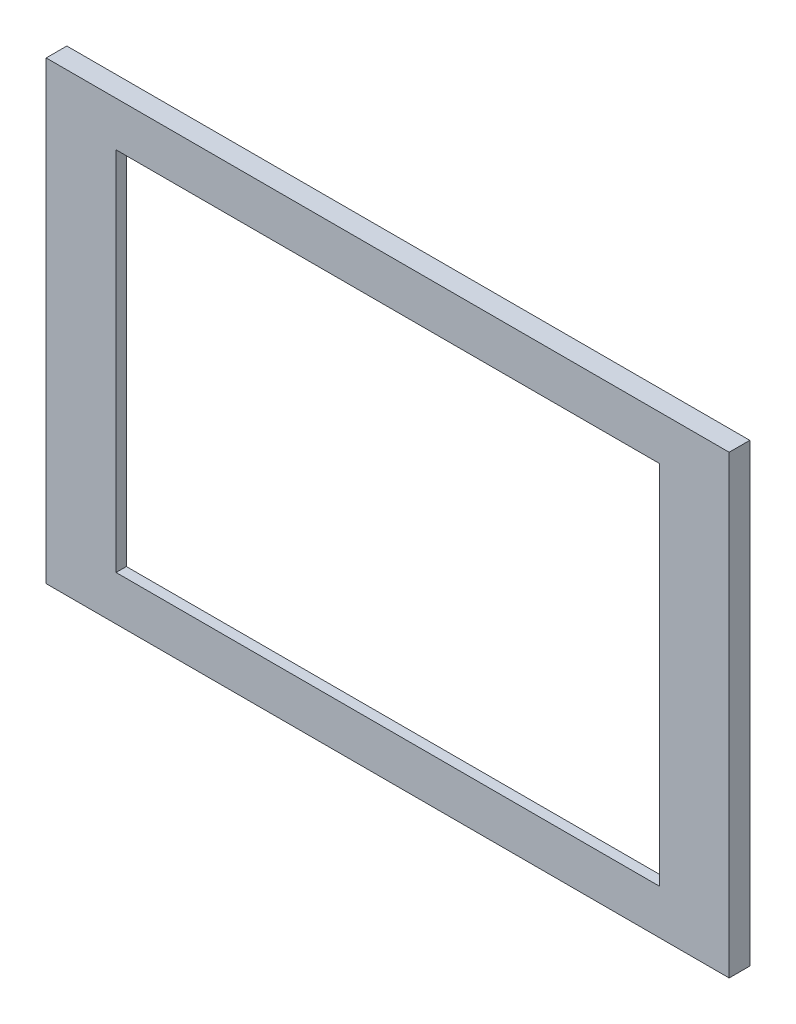
ISO-10303-21;
HEADER;
FILE_DESCRIPTION(('STEP AP214'),'2;1');
FILE_NAME('part.step','',(''),(''),'','','');
FILE_SCHEMA(('AUTOMOTIVE_DESIGN { 1 0 10303 214 1 1 1 1 }'));
ENDSEC;
DATA;
#1=APPLICATION_CONTEXT('core data for automotive mechanical design processes');
#2=APPLICATION_PROTOCOL_DEFINITION('international standard','automotive_design',2000,#1);
#3=PRODUCT_CONTEXT('',#1,'mechanical');
#4=PRODUCT('Part','Part','',(#3));
#5=PRODUCT_RELATED_PRODUCT_CATEGORY('part','',(#4));
#6=PRODUCT_DEFINITION_FORMATION('','',#4);
#7=PRODUCT_DEFINITION_CONTEXT('part definition',#1,'design');
#8=PRODUCT_DEFINITION('design','',#6,#7);
#9=PRODUCT_DEFINITION_SHAPE('','',#8);
#10=(LENGTH_UNIT() NAMED_UNIT(*) SI_UNIT(.MILLI.,.METRE.));
#11=(NAMED_UNIT(*) PLANE_ANGLE_UNIT() SI_UNIT($,.RADIAN.));
#12=(NAMED_UNIT(*) SI_UNIT($,.STERADIAN.) SOLID_ANGLE_UNIT());
#13=UNCERTAINTY_MEASURE_WITH_UNIT(LENGTH_MEASURE(1.E-05),#10,'distance_accuracy_value','');
#14=(GEOMETRIC_REPRESENTATION_CONTEXT(3) GLOBAL_UNCERTAINTY_ASSIGNED_CONTEXT((#13)) GLOBAL_UNIT_ASSIGNED_CONTEXT((#10,
#11,#12)) REPRESENTATION_CONTEXT('',''));
#15=CARTESIAN_POINT('',(0.,0.,0.));
#16=DIRECTION('',(0.,0.,1.));
#17=DIRECTION('',(1.,0.,0.));
#18=AXIS2_PLACEMENT_3D('',#15,#16,#17);
#19=CARTESIAN_POINT('',(0.,0.,3.175));
#20=DIRECTION('',(0.,0.,1.));
#21=DIRECTION('',(1.,0.,0.));
#22=AXIS2_PLACEMENT_3D('',#19,#20,#21);
#23=PLANE('',#22);
#24=DIRECTION('',(-1.,0.,0.));
#25=VECTOR('',#24,1.);
#26=CARTESIAN_POINT('',(-41.76,28.14,3.175));
#27=LINE('',#26,#25);
#28=CARTESIAN_POINT('',(41.76,28.14,3.175));
#29=VERTEX_POINT('',#28);
#30=CARTESIAN_POINT('',(-41.76,28.14,3.175));
#31=VERTEX_POINT('',#30);
#32=EDGE_CURVE('E231',#29,#31,#27,.T.);
#33=ORIENTED_EDGE('',*,*,#32,.F.);
#34=DIRECTION('',(0.,1.,0.));
#35=VECTOR('',#34,1.);
#36=CARTESIAN_POINT('',(41.76,-28.14,3.175));
#37=LINE('',#36,#35);
#38=CARTESIAN_POINT('',(41.76,-28.14,3.175));
#39=VERTEX_POINT('',#38);
#40=EDGE_CURVE('E219',#39,#29,#37,.T.);
#41=ORIENTED_EDGE('',*,*,#40,.F.);
#42=DIRECTION('',(1.,0.,0.));
#43=VECTOR('',#42,1.);
#44=CARTESIAN_POINT('',(-41.76,-28.14,3.175));
#45=LINE('',#44,#43);
#46=CARTESIAN_POINT('',(-41.76,-28.14,3.175));
#47=VERTEX_POINT('',#46);
#48=EDGE_CURVE('E238',#47,#39,#45,.T.);
#49=ORIENTED_EDGE('',*,*,#48,.F.);
#50=DIRECTION('',(0.,-1.,0.));
#51=VECTOR('',#50,1.);
#52=CARTESIAN_POINT('',(-41.76,-28.14,3.175));
#53=LINE('',#52,#51);
#54=EDGE_CURVE('E234',#31,#47,#53,.T.);
#55=ORIENTED_EDGE('',*,*,#54,.F.);
#56=EDGE_LOOP('',(#33,#41,#49,#55));
#57=FACE_BOUND('',#56,.T.);
#58=DIRECTION('',(1.,0.,0.));
#59=VECTOR('',#58,1.);
#60=CARTESIAN_POINT('',(-52.5,-35.,3.175));
#61=LINE('',#60,#59);
#62=CARTESIAN_POINT('',(-52.5,-35.,3.175));
#63=VERTEX_POINT('',#62);
#64=CARTESIAN_POINT('',(52.5,-35.,3.175));
#65=VERTEX_POINT('',#64);
#66=EDGE_CURVE('E145',#63,#65,#61,.T.);
#67=ORIENTED_EDGE('',*,*,#66,.T.);
#68=DIRECTION('',(0.,1.,0.));
#69=VECTOR('',#68,1.);
#70=CARTESIAN_POINT('',(52.5,35.,3.175));
#71=LINE('',#70,#69);
#72=CARTESIAN_POINT('',(52.5,35.,3.175));
#73=VERTEX_POINT('',#72);
#74=EDGE_CURVE('E158',#65,#73,#71,.T.);
#75=ORIENTED_EDGE('',*,*,#74,.T.);
#76=DIRECTION('',(-1.,0.,0.));
#77=VECTOR('',#76,1.);
#78=CARTESIAN_POINT('',(-52.5,35.,3.175));
#79=LINE('',#78,#77);
#80=CARTESIAN_POINT('',(-52.5,35.,3.175));
#81=VERTEX_POINT('',#80);
#82=EDGE_CURVE('E154',#73,#81,#79,.T.);
#83=ORIENTED_EDGE('',*,*,#82,.T.);
#84=DIRECTION('',(0.,-1.,0.));
#85=VECTOR('',#84,1.);
#86=CARTESIAN_POINT('',(-52.5,35.,3.175));
#87=LINE('',#86,#85);
#88=EDGE_CURVE('E61',#81,#63,#87,.T.);
#89=ORIENTED_EDGE('',*,*,#88,.T.);
#90=EDGE_LOOP('',(#67,#75,#83,#89));
#91=FACE_BOUND('',#90,.T.);
#92=ADVANCED_FACE('F45',(#57,#91),#23,.T.);
#93=CARTESIAN_POINT('',(0.,0.,0.));
#94=DIRECTION('',(0.,0.,1.));
#95=DIRECTION('',(1.,0.,0.));
#96=AXIS2_PLACEMENT_3D('',#93,#94,#95);
#97=PLANE('',#96);
#98=DIRECTION('',(1.,0.,0.));
#99=VECTOR('',#98,1.);
#100=CARTESIAN_POINT('',(47.385,30.54,0.));
#101=LINE('',#100,#99);
#102=CARTESIAN_POINT('',(-48.76,30.54,0.));
#103=VERTEX_POINT('',#102);
#104=CARTESIAN_POINT('',(47.385,30.54,0.));
#105=VERTEX_POINT('',#104);
#106=EDGE_CURVE('E205',#103,#105,#101,.T.);
#107=ORIENTED_EDGE('',*,*,#106,.F.);
#108=DIRECTION('',(0.,1.,0.));
#109=VECTOR('',#108,1.);
#110=CARTESIAN_POINT('',(-48.76,30.54,0.));
#111=LINE('',#110,#109);
#112=CARTESIAN_POINT('',(-48.76,-30.54,0.));
#113=VERTEX_POINT('',#112);
#114=EDGE_CURVE('E184',#113,#103,#111,.T.);
#115=ORIENTED_EDGE('',*,*,#114,.F.);
#116=DIRECTION('',(-1.,0.,0.));
#117=VECTOR('',#116,1.);
#118=CARTESIAN_POINT('',(47.385,-30.54,0.));
#119=LINE('',#118,#117);
#120=CARTESIAN_POINT('',(47.385,-30.54,0.));
#121=VERTEX_POINT('',#120);
#122=EDGE_CURVE('E190',#121,#113,#119,.T.);
#123=ORIENTED_EDGE('',*,*,#122,.F.);
#124=DIRECTION('',(0.,-1.,0.));
#125=VECTOR('',#124,1.);
#126=CARTESIAN_POINT('',(47.385,30.54,0.));
#127=LINE('',#126,#125);
#128=EDGE_CURVE('E209',#105,#121,#127,.T.);
#129=ORIENTED_EDGE('',*,*,#128,.F.);
#130=EDGE_LOOP('',(#107,#115,#123,#129));
#131=FACE_BOUND('',#130,.T.);
#132=DIRECTION('',(0.,1.,0.));
#133=VECTOR('',#132,1.);
#134=CARTESIAN_POINT('',(52.5,0.,0.));
#135=LINE('',#134,#133);
#136=CARTESIAN_POINT('',(52.5,-35.,0.));
#137=VERTEX_POINT('',#136);
#138=CARTESIAN_POINT('',(52.5,35.,0.));
#139=VERTEX_POINT('',#138);
#140=EDGE_CURVE('E11',#137,#139,#135,.T.);
#141=ORIENTED_EDGE('',*,*,#140,.F.);
#142=DIRECTION('',(1.,0.,0.));
#143=VECTOR('',#142,1.);
#144=CARTESIAN_POINT('',(0.,-35.,0.));
#145=LINE('',#144,#143);
#146=CARTESIAN_POINT('',(-52.5,-35.,0.));
#147=VERTEX_POINT('',#146);
#148=EDGE_CURVE('E54',#147,#137,#145,.T.);
#149=ORIENTED_EDGE('',*,*,#148,.F.);
#150=DIRECTION('',(0.,-1.,0.));
#151=VECTOR('',#150,1.);
#152=CARTESIAN_POINT('',(-52.5,0.,0.));
#153=LINE('',#152,#151);
#154=CARTESIAN_POINT('',(-52.5,35.,0.));
#155=VERTEX_POINT('',#154);
#156=EDGE_CURVE('E137',#155,#147,#153,.T.);
#157=ORIENTED_EDGE('',*,*,#156,.F.);
#158=DIRECTION('',(-1.,0.,0.));
#159=VECTOR('',#158,1.);
#160=CARTESIAN_POINT('',(0.,35.,0.));
#161=LINE('',#160,#159);
#162=EDGE_CURVE('E257',#139,#155,#161,.T.);
#163=ORIENTED_EDGE('',*,*,#162,.F.);
#164=EDGE_LOOP('',(#141,#149,#157,#163));
#165=FACE_BOUND('',#164,.T.);
#166=ADVANCED_FACE('F47',(#131,#165),#97,.F.);
#167=CARTESIAN_POINT('',(41.76,-28.14,3.175));
#168=DIRECTION('',(-1.,0.,0.));
#169=DIRECTION('',(0.,0.,1.));
#170=AXIS2_PLACEMENT_3D('',#167,#168,#169);
#171=PLANE('',#170);
#172=DIRECTION('',(0.,0.,-1.));
#173=VECTOR('',#172,1.);
#174=CARTESIAN_POINT('',(41.76,28.14,3.175));
#175=LINE('',#174,#173);
#176=CARTESIAN_POINT('',(41.76,28.14,1.5875));
#177=VERTEX_POINT('',#176);
#178=EDGE_CURVE('E253',#29,#177,#175,.T.);
#179=ORIENTED_EDGE('',*,*,#178,.T.);
#180=DIRECTION('',(0.,-1.,0.));
#181=VECTOR('',#180,1.);
#182=CARTESIAN_POINT('',(41.76,-28.14,1.5875));
#183=LINE('',#182,#181);
#184=CARTESIAN_POINT('',(41.76,-28.14,1.5875));
#185=VERTEX_POINT('',#184);
#186=EDGE_CURVE('E172',#177,#185,#183,.T.);
#187=ORIENTED_EDGE('',*,*,#186,.T.);
#188=DIRECTION('',(0.,0.,-1.));
#189=VECTOR('',#188,1.);
#190=CARTESIAN_POINT('',(41.76,-28.14,3.175));
#191=LINE('',#190,#189);
#192=EDGE_CURVE('E241',#39,#185,#191,.T.);
#193=ORIENTED_EDGE('',*,*,#192,.F.);
#194=ORIENTED_EDGE('',*,*,#40,.T.);
#195=EDGE_LOOP('',(#179,#187,#193,#194));
#196=FACE_BOUND('',#195,.T.);
#197=ADVANCED_FACE('F282',(#196),#171,.T.);
#198=CARTESIAN_POINT('',(-41.76,28.14,3.175));
#199=DIRECTION('',(0.,-1.,0.));
#200=DIRECTION('',(0.,0.,-1.));
#201=AXIS2_PLACEMENT_3D('',#198,#199,#200);
#202=PLANE('',#201);
#203=DIRECTION('',(0.,0.,-1.));
#204=VECTOR('',#203,1.);
#205=CARTESIAN_POINT('',(-41.76,28.14,3.175));
#206=LINE('',#205,#204);
#207=CARTESIAN_POINT('',(-41.76,28.14,1.5875));
#208=VERTEX_POINT('',#207);
#209=EDGE_CURVE('E249',#31,#208,#206,.T.);
#210=ORIENTED_EDGE('',*,*,#209,.T.);
#211=DIRECTION('',(1.,0.,0.));
#212=VECTOR('',#211,1.);
#213=CARTESIAN_POINT('',(41.76,28.14,1.5875));
#214=LINE('',#213,#212);
#215=EDGE_CURVE('E163',#208,#177,#214,.T.);
#216=ORIENTED_EDGE('',*,*,#215,.T.);
#217=ORIENTED_EDGE('',*,*,#178,.F.);
#218=ORIENTED_EDGE('',*,*,#32,.T.);
#219=EDGE_LOOP('',(#210,#216,#217,#218));
#220=FACE_BOUND('',#219,.T.);
#221=ADVANCED_FACE('F288',(#220),#202,.T.);
#222=CARTESIAN_POINT('',(-41.76,-28.14,3.175));
#223=DIRECTION('',(1.,0.,0.));
#224=DIRECTION('',(0.,0.,-1.));
#225=AXIS2_PLACEMENT_3D('',#222,#223,#224);
#226=PLANE('',#225);
#227=DIRECTION('',(0.,0.,-1.));
#228=VECTOR('',#227,1.);
#229=CARTESIAN_POINT('',(-41.76,-28.14,3.175));
#230=LINE('',#229,#228);
#231=CARTESIAN_POINT('',(-41.76,-28.14,1.5875));
#232=VERTEX_POINT('',#231);
#233=EDGE_CURVE('E245',#47,#232,#230,.T.);
#234=ORIENTED_EDGE('',*,*,#233,.T.);
#235=DIRECTION('',(0.,1.,0.));
#236=VECTOR('',#235,1.);
#237=CARTESIAN_POINT('',(-41.76,28.14,1.5875));
#238=LINE('',#237,#236);
#239=EDGE_CURVE('E180',#232,#208,#238,.T.);
#240=ORIENTED_EDGE('',*,*,#239,.T.);
#241=ORIENTED_EDGE('',*,*,#209,.F.);
#242=ORIENTED_EDGE('',*,*,#54,.T.);
#243=EDGE_LOOP('',(#234,#240,#241,#242));
#244=FACE_BOUND('',#243,.T.);
#245=ADVANCED_FACE('F292',(#244),#226,.T.);
#246=CARTESIAN_POINT('',(-41.76,-28.14,3.175));
#247=DIRECTION('',(0.,1.,0.));
#248=DIRECTION('',(0.,0.,1.));
#249=AXIS2_PLACEMENT_3D('',#246,#247,#248);
#250=PLANE('',#249);
#251=ORIENTED_EDGE('',*,*,#192,.T.);
#252=DIRECTION('',(-1.,0.,0.));
#253=VECTOR('',#252,1.);
#254=CARTESIAN_POINT('',(-41.76,-28.14,1.5875));
#255=LINE('',#254,#253);
#256=EDGE_CURVE('E176',#185,#232,#255,.T.);
#257=ORIENTED_EDGE('',*,*,#256,.T.);
#258=ORIENTED_EDGE('',*,*,#233,.F.);
#259=ORIENTED_EDGE('',*,*,#48,.T.);
#260=EDGE_LOOP('',(#251,#257,#258,#259));
#261=FACE_BOUND('',#260,.T.);
#262=ADVANCED_FACE('F296',(#261),#250,.T.);
#263=CARTESIAN_POINT('',(-48.76,30.54,1.5875));
#264=DIRECTION('',(-1.,0.,0.));
#265=DIRECTION('',(0.,-1.,0.));
#266=AXIS2_PLACEMENT_3D('',#263,#264,#265);
#267=PLANE('',#266);
#268=ORIENTED_EDGE('',*,*,#114,.T.);
#269=DIRECTION('',(0.,0.,-1.));
#270=VECTOR('',#269,1.);
#271=CARTESIAN_POINT('',(-48.76,30.54,1.5875));
#272=LINE('',#271,#270);
#273=CARTESIAN_POINT('',(-48.76,30.54,1.5875));
#274=VERTEX_POINT('',#273);
#275=EDGE_CURVE('E202',#274,#103,#272,.T.);
#276=ORIENTED_EDGE('',*,*,#275,.F.);
#277=DIRECTION('',(0.,1.,0.));
#278=VECTOR('',#277,1.);
#279=CARTESIAN_POINT('',(-48.76,30.54,1.5875));
#280=LINE('',#279,#278);
#281=CARTESIAN_POINT('',(-48.76,-30.54,1.5875));
#282=VERTEX_POINT('',#281);
#283=EDGE_CURVE('E185',#282,#274,#280,.T.);
#284=ORIENTED_EDGE('',*,*,#283,.F.);
#285=DIRECTION('',(0.,0.,-1.));
#286=VECTOR('',#285,1.);
#287=CARTESIAN_POINT('',(-48.76,-30.54,1.5875));
#288=LINE('',#287,#286);
#289=EDGE_CURVE('E216',#282,#113,#288,.T.);
#290=ORIENTED_EDGE('',*,*,#289,.T.);
#291=EDGE_LOOP('',(#268,#276,#284,#290));
#292=FACE_BOUND('',#291,.T.);
#293=ADVANCED_FACE('F300',(#292),#267,.F.);
#294=CARTESIAN_POINT('',(47.385,-30.54,1.5875));
#295=DIRECTION('',(0.,-1.,0.));
#296=DIRECTION('',(1.,0.,0.));
#297=AXIS2_PLACEMENT_3D('',#294,#295,#296);
#298=PLANE('',#297);
#299=ORIENTED_EDGE('',*,*,#122,.T.);
#300=ORIENTED_EDGE('',*,*,#289,.F.);
#301=DIRECTION('',(-1.,0.,0.));
#302=VECTOR('',#301,1.);
#303=CARTESIAN_POINT('',(47.385,-30.54,1.5875));
#304=LINE('',#303,#302);
#305=CARTESIAN_POINT('',(47.385,-30.54,1.5875));
#306=VERTEX_POINT('',#305);
#307=EDGE_CURVE('E198',#306,#282,#304,.T.);
#308=ORIENTED_EDGE('',*,*,#307,.F.);
#309=DIRECTION('',(0.,0.,-1.));
#310=VECTOR('',#309,1.);
#311=CARTESIAN_POINT('',(47.385,-30.54,1.5875));
#312=LINE('',#311,#310);
#313=EDGE_CURVE('E220',#306,#121,#312,.T.);
#314=ORIENTED_EDGE('',*,*,#313,.T.);
#315=EDGE_LOOP('',(#299,#300,#308,#314));
#316=FACE_BOUND('',#315,.T.);
#317=ADVANCED_FACE('F304',(#316),#298,.F.);
#318=CARTESIAN_POINT('',(47.385,30.54,1.5875));
#319=DIRECTION('',(1.,0.,0.));
#320=DIRECTION('',(0.,1.,0.));
#321=AXIS2_PLACEMENT_3D('',#318,#319,#320);
#322=PLANE('',#321);
#323=ORIENTED_EDGE('',*,*,#128,.T.);
#324=ORIENTED_EDGE('',*,*,#313,.F.);
#325=DIRECTION('',(0.,-1.,0.));
#326=VECTOR('',#325,1.);
#327=CARTESIAN_POINT('',(47.385,30.54,1.5875));
#328=LINE('',#327,#326);
#329=CARTESIAN_POINT('',(47.385,30.54,1.5875));
#330=VERTEX_POINT('',#329);
#331=EDGE_CURVE('E194',#330,#306,#328,.T.);
#332=ORIENTED_EDGE('',*,*,#331,.F.);
#333=DIRECTION('',(0.,0.,-1.));
#334=VECTOR('',#333,1.);
#335=CARTESIAN_POINT('',(47.385,30.54,1.5875));
#336=LINE('',#335,#334);
#337=EDGE_CURVE('E223',#330,#105,#336,.T.);
#338=ORIENTED_EDGE('',*,*,#337,.T.);
#339=EDGE_LOOP('',(#323,#324,#332,#338));
#340=FACE_BOUND('',#339,.T.);
#341=ADVANCED_FACE('F310',(#340),#322,.F.);
#342=CARTESIAN_POINT('',(47.385,30.54,1.5875));
#343=DIRECTION('',(0.,1.,0.));
#344=DIRECTION('',(-1.,0.,0.));
#345=AXIS2_PLACEMENT_3D('',#342,#343,#344);
#346=PLANE('',#345);
#347=ORIENTED_EDGE('',*,*,#106,.T.);
#348=ORIENTED_EDGE('',*,*,#337,.F.);
#349=DIRECTION('',(1.,0.,0.));
#350=VECTOR('',#349,1.);
#351=CARTESIAN_POINT('',(47.385,30.54,1.5875));
#352=LINE('',#351,#350);
#353=EDGE_CURVE('E189',#274,#330,#352,.T.);
#354=ORIENTED_EDGE('',*,*,#353,.F.);
#355=ORIENTED_EDGE('',*,*,#275,.T.);
#356=EDGE_LOOP('',(#347,#348,#354,#355));
#357=FACE_BOUND('',#356,.T.);
#358=ADVANCED_FACE('F306',(#357),#346,.F.);
#359=CARTESIAN_POINT('',(0.,0.,1.5875));
#360=DIRECTION('',(0.,0.,-1.));
#361=DIRECTION('',(-1.,0.,0.));
#362=AXIS2_PLACEMENT_3D('',#359,#360,#361);
#363=PLANE('',#362);
#364=ORIENTED_EDGE('',*,*,#239,.F.);
#365=ORIENTED_EDGE('',*,*,#256,.F.);
#366=ORIENTED_EDGE('',*,*,#186,.F.);
#367=ORIENTED_EDGE('',*,*,#215,.F.);
#368=EDGE_LOOP('',(#364,#365,#366,#367));
#369=FACE_BOUND('',#368,.T.);
#370=ORIENTED_EDGE('',*,*,#283,.T.);
#371=ORIENTED_EDGE('',*,*,#353,.T.);
#372=ORIENTED_EDGE('',*,*,#331,.T.);
#373=ORIENTED_EDGE('',*,*,#307,.T.);
#374=EDGE_LOOP('',(#370,#371,#372,#373));
#375=FACE_BOUND('',#374,.T.);
#376=ADVANCED_FACE('F309',(#369,#375),#363,.T.);
#377=CARTESIAN_POINT('',(52.5,35.,-6.825));
#378=DIRECTION('',(1.,0.,0.));
#379=DIRECTION('',(0.,1.,0.));
#380=AXIS2_PLACEMENT_3D('',#377,#378,#379);
#381=PLANE('',#380);
#382=ORIENTED_EDGE('',*,*,#140,.T.);
#383=DIRECTION('',(0.,0.,1.));
#384=VECTOR('',#383,1.);
#385=CARTESIAN_POINT('',(52.5,35.,-6.825));
#386=LINE('',#385,#384);
#387=EDGE_CURVE('E69',#139,#73,#386,.T.);
#388=ORIENTED_EDGE('',*,*,#387,.T.);
#389=ORIENTED_EDGE('',*,*,#74,.F.);
#390=DIRECTION('',(0.,0.,1.));
#391=VECTOR('',#390,1.);
#392=CARTESIAN_POINT('',(52.5,-35.,-6.825));
#393=LINE('',#392,#391);
#394=EDGE_CURVE('E141',#137,#65,#393,.T.);
#395=ORIENTED_EDGE('',*,*,#394,.F.);
#396=EDGE_LOOP('',(#382,#388,#389,#395));
#397=FACE_BOUND('',#396,.T.);
#398=ADVANCED_FACE('F265',(#397),#381,.T.);
#399=CARTESIAN_POINT('',(-52.5,-35.,-6.825));
#400=DIRECTION('',(0.,-1.,0.));
#401=DIRECTION('',(0.,0.,-1.));
#402=AXIS2_PLACEMENT_3D('',#399,#400,#401);
#403=PLANE('',#402);
#404=ORIENTED_EDGE('',*,*,#148,.T.);
#405=ORIENTED_EDGE('',*,*,#394,.T.);
#406=ORIENTED_EDGE('',*,*,#66,.F.);
#407=DIRECTION('',(0.,0.,1.));
#408=VECTOR('',#407,1.);
#409=CARTESIAN_POINT('',(-52.5,-35.,-6.825));
#410=LINE('',#409,#408);
#411=EDGE_CURVE('E133',#147,#63,#410,.T.);
#412=ORIENTED_EDGE('',*,*,#411,.F.);
#413=EDGE_LOOP('',(#404,#405,#406,#412));
#414=FACE_BOUND('',#413,.T.);
#415=ADVANCED_FACE('F146',(#414),#403,.T.);
#416=CARTESIAN_POINT('',(-52.5,35.,-6.825));
#417=DIRECTION('',(-1.,0.,0.));
#418=DIRECTION('',(0.,-1.,0.));
#419=AXIS2_PLACEMENT_3D('',#416,#417,#418);
#420=PLANE('',#419);
#421=ORIENTED_EDGE('',*,*,#156,.T.);
#422=ORIENTED_EDGE('',*,*,#411,.T.);
#423=ORIENTED_EDGE('',*,*,#88,.F.);
#424=DIRECTION('',(0.,0.,1.));
#425=VECTOR('',#424,1.);
#426=CARTESIAN_POINT('',(-52.5,35.,-6.825));
#427=LINE('',#426,#425);
#428=EDGE_CURVE('E142',#155,#81,#427,.T.);
#429=ORIENTED_EDGE('',*,*,#428,.F.);
#430=EDGE_LOOP('',(#421,#422,#423,#429));
#431=FACE_BOUND('',#430,.T.);
#432=ADVANCED_FACE('F135',(#431),#420,.T.);
#433=CARTESIAN_POINT('',(-52.5,35.,-6.825));
#434=DIRECTION('',(0.,1.,0.));
#435=DIRECTION('',(0.,0.,1.));
#436=AXIS2_PLACEMENT_3D('',#433,#434,#435);
#437=PLANE('',#436);
#438=ORIENTED_EDGE('',*,*,#162,.T.);
#439=ORIENTED_EDGE('',*,*,#428,.T.);
#440=ORIENTED_EDGE('',*,*,#82,.F.);
#441=ORIENTED_EDGE('',*,*,#387,.F.);
#442=EDGE_LOOP('',(#438,#439,#440,#441));
#443=FACE_BOUND('',#442,.T.);
#444=ADVANCED_FACE('F267',(#443),#437,.T.);
#445=CLOSED_SHELL('',(#92,#166,#197,#221,#245,#262,#293,#317,#341,#358,#376,#398,#415,#432,#444));
#446=MANIFOLD_SOLID_BREP('B2',#445);
#447=ADVANCED_BREP_SHAPE_REPRESENTATION('',(#18,#446),#14);
#448=SHAPE_DEFINITION_REPRESENTATION(#9,#447);
ENDSEC;
END-ISO-10303-21;
